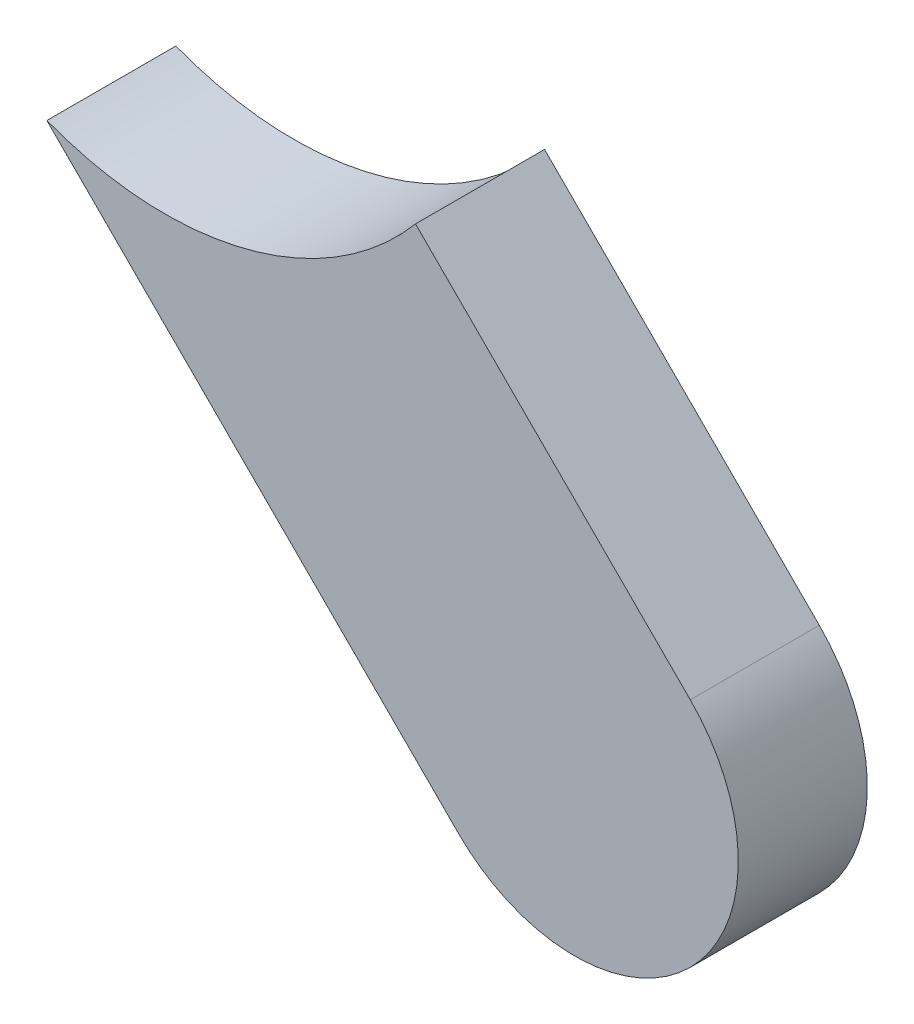
ISO-10303-21;
HEADER;
FILE_DESCRIPTION(('STEP AP214'),'2;1');
FILE_NAME('part.step','',(''),(''),'','','');
FILE_SCHEMA(('AUTOMOTIVE_DESIGN { 1 0 10303 214 1 1 1 1 }'));
ENDSEC;
DATA;
#1=APPLICATION_CONTEXT('core data for automotive mechanical design processes');
#2=APPLICATION_PROTOCOL_DEFINITION('international standard','automotive_design',2000,#1);
#3=PRODUCT_CONTEXT('',#1,'mechanical');
#4=PRODUCT('Part','Part','',(#3));
#5=PRODUCT_RELATED_PRODUCT_CATEGORY('part','',(#4));
#6=PRODUCT_DEFINITION_FORMATION('','',#4);
#7=PRODUCT_DEFINITION_CONTEXT('part definition',#1,'design');
#8=PRODUCT_DEFINITION('design','',#6,#7);
#9=PRODUCT_DEFINITION_SHAPE('','',#8);
#10=(LENGTH_UNIT() NAMED_UNIT(*) SI_UNIT(.MILLI.,.METRE.));
#11=(NAMED_UNIT(*) PLANE_ANGLE_UNIT() SI_UNIT($,.RADIAN.));
#12=(NAMED_UNIT(*) SI_UNIT($,.STERADIAN.) SOLID_ANGLE_UNIT());
#13=UNCERTAINTY_MEASURE_WITH_UNIT(LENGTH_MEASURE(1.E-05),#10,'distance_accuracy_value','');
#14=(GEOMETRIC_REPRESENTATION_CONTEXT(3) GLOBAL_UNCERTAINTY_ASSIGNED_CONTEXT((#13)) GLOBAL_UNIT_ASSIGNED_CONTEXT((#10,
#11,#12)) REPRESENTATION_CONTEXT('',''));
#15=CARTESIAN_POINT('',(0.,0.,0.));
#16=DIRECTION('',(0.,0.,1.));
#17=DIRECTION('',(1.,0.,0.));
#18=AXIS2_PLACEMENT_3D('',#15,#16,#17);
#19=CARTESIAN_POINT('',(96.46739406,117.50581528,0.));
#20=DIRECTION('',(0.707106781186556,0.70710678118654,0.));
#21=DIRECTION('',(0.70710678118654,-0.707106781186556,0.));
#22=AXIS2_PLACEMENT_3D('',#19,#20,#21);
#23=PLANE('',#22);
#24=DIRECTION('',(0.70710678118654,-0.707106781186556,0.));
#25=VECTOR('',#24,1.);
#26=CARTESIAN_POINT('',(96.46739406,117.50581528,0.1999996));
#27=LINE('',#26,#25);
#28=CARTESIAN_POINT('',(96.46739406,117.50581528,0.1999996));
#29=VERTEX_POINT('',#28);
#30=CARTESIAN_POINT('',(97.1023966,116.87081274,0.1999996));
#31=VERTEX_POINT('',#30);
#32=EDGE_CURVE('E11',#29,#31,#27,.T.);
#33=ORIENTED_EDGE('',*,*,#32,.F.);
#34=DIRECTION('',(0.,0.,1.));
#35=VECTOR('',#34,1.);
#36=CARTESIAN_POINT('',(96.46739406,117.50581528,0.));
#37=LINE('',#36,#35);
#38=CARTESIAN_POINT('',(96.46739406,117.50581528,0.));
#39=VERTEX_POINT('',#38);
#40=EDGE_CURVE('E24',#39,#29,#37,.T.);
#41=ORIENTED_EDGE('',*,*,#40,.F.);
#42=DIRECTION('',(0.70710678118654,-0.707106781186556,0.));
#43=VECTOR('',#42,1.);
#44=CARTESIAN_POINT('',(96.46739406,117.50581528,0.));
#45=LINE('',#44,#43);
#46=CARTESIAN_POINT('',(97.1023966,116.87081274,0.));
#47=VERTEX_POINT('',#46);
#48=EDGE_CURVE('E82',#39,#47,#45,.T.);
#49=ORIENTED_EDGE('',*,*,#48,.T.);
#50=DIRECTION('',(0.,0.,1.));
#51=VECTOR('',#50,1.);
#52=CARTESIAN_POINT('',(97.1023966,116.87081274,0.));
#53=LINE('',#52,#51);
#54=EDGE_CURVE('E37',#47,#31,#53,.T.);
#55=ORIENTED_EDGE('',*,*,#54,.T.);
#56=EDGE_LOOP('',(#33,#41,#49,#55));
#57=FACE_BOUND('',#56,.T.);
#58=ADVANCED_FACE('F17',(#57),#23,.F.);
#59=CARTESIAN_POINT('',(97.28200127,117.05041741,0.));
#60=DIRECTION('',(0.,0.,-1.));
#61=DIRECTION('',(-0.70710678118652,-0.707106781186576,0.));
#62=AXIS2_PLACEMENT_3D('',#59,#60,#61);
#63=CYLINDRICAL_SURFACE('',#62,0.253999360179539);
#64=CARTESIAN_POINT('',(97.28200127,117.05041741,0.1999996));
#65=DIRECTION('',(0.,0.,1.));
#66=DIRECTION('',(-0.70710678118652,-0.707106781186576,0.));
#67=AXIS2_PLACEMENT_3D('',#64,#65,#66);
#68=CIRCLE('',#67,0.253999360179539);
#69=CARTESIAN_POINT('',(97.46160594,117.23002208,0.1999996));
#70=VERTEX_POINT('',#69);
#71=EDGE_CURVE('E98',#31,#70,#68,.T.);
#72=ORIENTED_EDGE('',*,*,#71,.F.);
#73=ORIENTED_EDGE('',*,*,#54,.F.);
#74=CARTESIAN_POINT('',(97.28200127,117.05041741,0.));
#75=DIRECTION('',(0.,0.,1.));
#76=DIRECTION('',(-0.70710678118652,-0.707106781186576,0.));
#77=AXIS2_PLACEMENT_3D('',#74,#75,#76);
#78=CIRCLE('',#77,0.253999360179539);
#79=CARTESIAN_POINT('',(97.46160594,117.23002208,0.));
#80=VERTEX_POINT('',#79);
#81=EDGE_CURVE('E95',#47,#80,#78,.T.);
#82=ORIENTED_EDGE('',*,*,#81,.T.);
#83=DIRECTION('',(0.,0.,1.));
#84=VECTOR('',#83,1.);
#85=CARTESIAN_POINT('',(97.46160594,117.23002208,0.));
#86=LINE('',#85,#84);
#87=EDGE_CURVE('E93',#80,#70,#86,.T.);
#88=ORIENTED_EDGE('',*,*,#87,.T.);
#89=EDGE_LOOP('',(#72,#73,#82,#88));
#90=FACE_BOUND('',#89,.T.);
#91=ADVANCED_FACE('F104',(#90),#63,.T.);
#92=CARTESIAN_POINT('',(97.46160594,117.23002208,0.));
#93=DIRECTION('',(-0.707106781186556,-0.70710678118654,0.));
#94=DIRECTION('',(-0.70710678118654,0.707106781186556,0.));
#95=AXIS2_PLACEMENT_3D('',#92,#93,#94);
#96=PLANE('',#95);
#97=DIRECTION('',(-0.70710678118654,0.707106781186556,0.));
#98=VECTOR('',#97,1.);
#99=CARTESIAN_POINT('',(97.46160594,117.23002208,0.1999996));
#100=LINE('',#99,#98);
#101=CARTESIAN_POINT('',(97.035700160595,117.655927859405,0.1999996));
#102=VERTEX_POINT('',#101);
#103=EDGE_CURVE('E90',#70,#102,#100,.T.);
#104=ORIENTED_EDGE('',*,*,#103,.F.);
#105=ORIENTED_EDGE('',*,*,#87,.F.);
#106=DIRECTION('',(-0.70710678118654,0.707106781186556,0.));
#107=VECTOR('',#106,1.);
#108=CARTESIAN_POINT('',(97.46160594,117.23002208,0.));
#109=LINE('',#108,#107);
#110=CARTESIAN_POINT('',(97.035700160595,117.655927859405,0.));
#111=VERTEX_POINT('',#110);
#112=EDGE_CURVE('E88',#80,#111,#109,.T.);
#113=ORIENTED_EDGE('',*,*,#112,.T.);
#114=DIRECTION('',(0.,0.,1.));
#115=VECTOR('',#114,1.);
#116=CARTESIAN_POINT('',(97.035700160595,117.655927859405,0.));
#117=LINE('',#116,#115);
#118=EDGE_CURVE('E69',#111,#102,#117,.T.);
#119=ORIENTED_EDGE('',*,*,#118,.T.);
#120=EDGE_LOOP('',(#104,#105,#113,#119));
#121=FACE_BOUND('',#120,.T.);
#122=ADVANCED_FACE('F109',(#121),#96,.F.);
#123=CARTESIAN_POINT('',(96.647,117.983,0.));
#124=DIRECTION('',(0.,0.,-1.));
#125=DIRECTION('',(1.,0.,0.));
#126=AXIS2_PLACEMENT_3D('',#123,#124,#125);
#127=CYLINDRICAL_SURFACE('',#126,0.508);
#128=DIRECTION('',(0.,0.,1.));
#129=VECTOR('',#128,1.);
#130=CARTESIAN_POINT('',(96.4642581193465,117.509006956744,0.));
#131=LINE('',#130,#129);
#132=CARTESIAN_POINT('',(96.4642581193465,117.509006956744,0.));
#133=VERTEX_POINT('',#132);
#134=CARTESIAN_POINT('',(96.4642581193465,117.509006956744,0.1999996));
#135=VERTEX_POINT('',#134);
#136=EDGE_CURVE('E59',#133,#135,#131,.T.);
#137=ORIENTED_EDGE('',*,*,#136,.T.);
#138=CARTESIAN_POINT('',(96.647,117.983,0.1999996));
#139=DIRECTION('',(0.,0.,1.));
#140=DIRECTION('',(1.,0.,0.));
#141=AXIS2_PLACEMENT_3D('',#138,#139,#140);
#142=CIRCLE('',#141,0.508);
#143=EDGE_CURVE('E70',#135,#102,#142,.T.);
#144=ORIENTED_EDGE('',*,*,#143,.T.);
#145=ORIENTED_EDGE('',*,*,#118,.F.);
#146=CARTESIAN_POINT('',(96.647,117.983,0.));
#147=DIRECTION('',(0.,0.,1.));
#148=DIRECTION('',(1.,0.,0.));
#149=AXIS2_PLACEMENT_3D('',#146,#147,#148);
#150=CIRCLE('',#149,0.508);
#151=EDGE_CURVE('E73',#133,#111,#150,.T.);
#152=ORIENTED_EDGE('',*,*,#151,.F.);
#153=EDGE_LOOP('',(#137,#144,#145,#152));
#154=FACE_BOUND('',#153,.T.);
#155=ADVANCED_FACE('F74',(#154),#127,.F.);
#156=CARTESIAN_POINT('',(96.64699873,117.68541995,0.));
#157=DIRECTION('',(0.,0.,-1.));
#158=DIRECTION('',(0.707106781186548,0.707106781186548,0.));
#159=AXIS2_PLACEMENT_3D('',#156,#157,#158);
#160=CYLINDRICAL_SURFACE('',#159,0.253999360179539);
#161=CARTESIAN_POINT('',(96.64699873,117.68541995,0.1999996));
#162=DIRECTION('',(0.,0.,1.));
#163=DIRECTION('',(0.707106781186548,0.707106781186548,0.));
#164=AXIS2_PLACEMENT_3D('',#161,#162,#163);
#165=CIRCLE('',#164,0.253999360179539);
#166=EDGE_CURVE('E65',#135,#29,#165,.T.);
#167=ORIENTED_EDGE('',*,*,#166,.F.);
#168=ORIENTED_EDGE('',*,*,#136,.F.);
#169=CARTESIAN_POINT('',(96.64699873,117.68541995,0.));
#170=DIRECTION('',(0.,0.,1.));
#171=DIRECTION('',(0.707106781186548,0.707106781186548,0.));
#172=AXIS2_PLACEMENT_3D('',#169,#170,#171);
#173=CIRCLE('',#172,0.253999360179539);
#174=EDGE_CURVE('E63',#133,#39,#173,.T.);
#175=ORIENTED_EDGE('',*,*,#174,.T.);
#176=ORIENTED_EDGE('',*,*,#40,.T.);
#177=EDGE_LOOP('',(#167,#168,#175,#176));
#178=FACE_BOUND('',#177,.T.);
#179=ADVANCED_FACE('F61',(#178),#160,.T.);
#180=CARTESIAN_POINT('',(96.46739406,117.50581528,0.));
#181=DIRECTION('',(0.,0.,-1.));
#182=DIRECTION('',(-1.,0.,0.));
#183=AXIS2_PLACEMENT_3D('',#180,#181,#182);
#184=PLANE('',#183);
#185=ORIENTED_EDGE('',*,*,#48,.F.);
#186=ORIENTED_EDGE('',*,*,#174,.F.);
#187=ORIENTED_EDGE('',*,*,#151,.T.);
#188=ORIENTED_EDGE('',*,*,#112,.F.);
#189=ORIENTED_EDGE('',*,*,#81,.F.);
#190=EDGE_LOOP('',(#185,#186,#187,#188,#189));
#191=FACE_BOUND('',#190,.T.);
#192=ADVANCED_FACE('F80',(#191),#184,.T.);
#193=CARTESIAN_POINT('',(96.46739406,117.50581528,0.1999996));
#194=DIRECTION('',(0.,0.,-1.));
#195=DIRECTION('',(-1.,0.,0.));
#196=AXIS2_PLACEMENT_3D('',#193,#194,#195);
#197=PLANE('',#196);
#198=ORIENTED_EDGE('',*,*,#166,.T.);
#199=ORIENTED_EDGE('',*,*,#32,.T.);
#200=ORIENTED_EDGE('',*,*,#71,.T.);
#201=ORIENTED_EDGE('',*,*,#103,.T.);
#202=ORIENTED_EDGE('',*,*,#143,.F.);
#203=EDGE_LOOP('',(#198,#199,#200,#201,#202));
#204=FACE_BOUND('',#203,.T.);
#205=ADVANCED_FACE('F107',(#204),#197,.F.);
#206=CLOSED_SHELL('',(#58,#91,#122,#155,#179,#192,#205));
#207=MANIFOLD_SOLID_BREP('B1',#206);
#208=ADVANCED_BREP_SHAPE_REPRESENTATION('',(#18,#207),#14);
#209=SHAPE_DEFINITION_REPRESENTATION(#9,#208);
ENDSEC;
END-ISO-10303-21;
